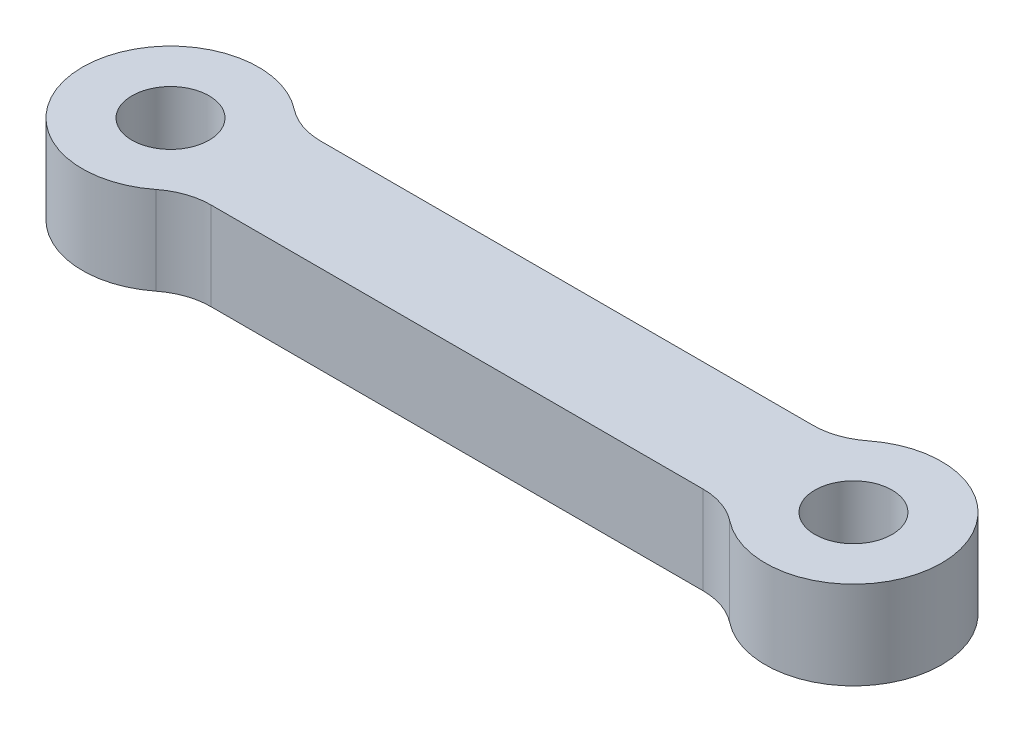
ISO-10303-21;
HEADER;
FILE_DESCRIPTION(('STEP AP214'),'2;1');
FILE_NAME('part.step','',(''),(''),'','','');
FILE_SCHEMA(('AUTOMOTIVE_DESIGN { 1 0 10303 214 1 1 1 1 }'));
ENDSEC;
DATA;
#1=APPLICATION_CONTEXT('core data for automotive mechanical design processes');
#2=APPLICATION_PROTOCOL_DEFINITION('international standard','automotive_design',2000,#1);
#3=PRODUCT_CONTEXT('',#1,'mechanical');
#4=PRODUCT('Part','Part','',(#3));
#5=PRODUCT_RELATED_PRODUCT_CATEGORY('part','',(#4));
#6=PRODUCT_DEFINITION_FORMATION('','',#4);
#7=PRODUCT_DEFINITION_CONTEXT('part definition',#1,'design');
#8=PRODUCT_DEFINITION('design','',#6,#7);
#9=PRODUCT_DEFINITION_SHAPE('','',#8);
#10=(LENGTH_UNIT() NAMED_UNIT(*) SI_UNIT(.MILLI.,.METRE.));
#11=(NAMED_UNIT(*) PLANE_ANGLE_UNIT() SI_UNIT($,.RADIAN.));
#12=(NAMED_UNIT(*) SI_UNIT($,.STERADIAN.) SOLID_ANGLE_UNIT());
#13=UNCERTAINTY_MEASURE_WITH_UNIT(LENGTH_MEASURE(1.E-05),#10,'distance_accuracy_value','');
#14=(GEOMETRIC_REPRESENTATION_CONTEXT(3) GLOBAL_UNCERTAINTY_ASSIGNED_CONTEXT((#13)) GLOBAL_UNIT_ASSIGNED_CONTEXT((#10,
#11,#12)) REPRESENTATION_CONTEXT('',''));
#15=CARTESIAN_POINT('',(0.,0.,0.));
#16=DIRECTION('',(0.,0.,1.));
#17=DIRECTION('',(1.,0.,0.));
#18=AXIS2_PLACEMENT_3D('',#15,#16,#17);
#19=CARTESIAN_POINT('',(31.,4.,0.));
#20=DIRECTION('',(0.,-1.,0.));
#21=DIRECTION('',(0.,0.,-1.));
#22=AXIS2_PLACEMENT_3D('',#19,#20,#21);
#23=CYLINDRICAL_SURFACE('',#22,4.00000000000001);
#24=CARTESIAN_POINT('',(31.,0.,0.));
#25=DIRECTION('',(0.,-1.,0.));
#26=DIRECTION('',(0.,0.,-1.));
#27=AXIS2_PLACEMENT_3D('',#24,#25,#26);
#28=CIRCLE('',#27,4.00000000000001);
#29=CARTESIAN_POINT('',(28.525641703473,0.,-3.14285714285714));
#30=VERTEX_POINT('',#29);
#31=CARTESIAN_POINT('',(28.525641703473,0.,3.14285714285714));
#32=VERTEX_POINT('',#31);
#33=EDGE_CURVE('E129',#30,#32,#28,.T.);
#34=ORIENTED_EDGE('',*,*,#33,.F.);
#35=DIRECTION('',(0.,-1.,0.));
#36=VECTOR('',#35,1.);
#37=CARTESIAN_POINT('',(28.525641703473,4.,-3.14285714285714));
#38=LINE('',#37,#36);
#39=CARTESIAN_POINT('',(28.525641703473,4.,-3.14285714285714));
#40=VERTEX_POINT('',#39);
#41=EDGE_CURVE('E11',#40,#30,#38,.T.);
#42=ORIENTED_EDGE('',*,*,#41,.F.);
#43=CARTESIAN_POINT('',(31.,4.,0.));
#44=DIRECTION('',(0.,-1.,0.));
#45=DIRECTION('',(0.,0.,-1.));
#46=AXIS2_PLACEMENT_3D('',#43,#44,#45);
#47=CIRCLE('',#46,4.00000000000001);
#48=CARTESIAN_POINT('',(28.525641703473,4.,3.14285714285714));
#49=VERTEX_POINT('',#48);
#50=EDGE_CURVE('E150',#40,#49,#47,.T.);
#51=ORIENTED_EDGE('',*,*,#50,.T.);
#52=DIRECTION('',(0.,-1.,0.));
#53=VECTOR('',#52,1.);
#54=CARTESIAN_POINT('',(28.525641703473,4.,3.14285714285714));
#55=LINE('',#54,#53);
#56=EDGE_CURVE('E35',#49,#32,#55,.T.);
#57=ORIENTED_EDGE('',*,*,#56,.T.);
#58=EDGE_LOOP('',(#34,#42,#51,#57));
#59=FACE_BOUND('',#58,.T.);
#60=ADVANCED_FACE('F32',(#59),#23,.T.);
#61=CARTESIAN_POINT('',(26.6698729810778,4.,-5.5));
#62=DIRECTION('',(0.,-1.,0.));
#63=DIRECTION('',(0.,0.,-1.));
#64=AXIS2_PLACEMENT_3D('',#61,#62,#63);
#65=CYLINDRICAL_SURFACE('',#64,3.);
#66=CARTESIAN_POINT('',(26.6698729810778,0.,-5.5));
#67=DIRECTION('',(0.,1.,0.));
#68=DIRECTION('',(0.,0.,1.));
#69=AXIS2_PLACEMENT_3D('',#66,#67,#68);
#70=CIRCLE('',#69,3.);
#71=CARTESIAN_POINT('',(26.6698729810778,0.,-2.5));
#72=VERTEX_POINT('',#71);
#73=EDGE_CURVE('E148',#72,#30,#70,.T.);
#74=ORIENTED_EDGE('',*,*,#73,.F.);
#75=DIRECTION('',(0.,-1.,0.));
#76=VECTOR('',#75,1.);
#77=CARTESIAN_POINT('',(26.6698729810778,4.,-2.5));
#78=LINE('',#77,#76);
#79=CARTESIAN_POINT('',(26.6698729810778,4.,-2.5));
#80=VERTEX_POINT('',#79);
#81=EDGE_CURVE('E41',#80,#72,#78,.T.);
#82=ORIENTED_EDGE('',*,*,#81,.F.);
#83=CARTESIAN_POINT('',(26.6698729810778,4.,-5.5));
#84=DIRECTION('',(0.,1.,0.));
#85=DIRECTION('',(0.,0.,1.));
#86=AXIS2_PLACEMENT_3D('',#83,#84,#85);
#87=CIRCLE('',#86,3.);
#88=EDGE_CURVE('E119',#80,#40,#87,.T.);
#89=ORIENTED_EDGE('',*,*,#88,.T.);
#90=ORIENTED_EDGE('',*,*,#41,.T.);
#91=EDGE_LOOP('',(#74,#82,#89,#90));
#92=FACE_BOUND('',#91,.T.);
#93=ADVANCED_FACE('F162',(#92),#65,.F.);
#94=CARTESIAN_POINT('',(4.3301270189222,4.,-2.5));
#95=DIRECTION('',(0.,0.,-1.));
#96=DIRECTION('',(-1.,0.,0.));
#97=AXIS2_PLACEMENT_3D('',#94,#95,#96);
#98=PLANE('',#97);
#99=DIRECTION('',(1.,0.,0.));
#100=VECTOR('',#99,1.);
#101=CARTESIAN_POINT('',(4.3301270189222,0.,-2.5));
#102=LINE('',#101,#100);
#103=CARTESIAN_POINT('',(4.3301270189222,0.,-2.5));
#104=VERTEX_POINT('',#103);
#105=EDGE_CURVE('E106',#104,#72,#102,.T.);
#106=ORIENTED_EDGE('',*,*,#105,.F.);
#107=DIRECTION('',(0.,-1.,0.));
#108=VECTOR('',#107,1.);
#109=CARTESIAN_POINT('',(4.3301270189222,4.,-2.5));
#110=LINE('',#109,#108);
#111=CARTESIAN_POINT('',(4.3301270189222,4.,-2.5));
#112=VERTEX_POINT('',#111);
#113=EDGE_CURVE('E101',#112,#104,#110,.T.);
#114=ORIENTED_EDGE('',*,*,#113,.F.);
#115=DIRECTION('',(1.,0.,0.));
#116=VECTOR('',#115,1.);
#117=CARTESIAN_POINT('',(4.3301270189222,4.,-2.5));
#118=LINE('',#117,#116);
#119=EDGE_CURVE('E104',#112,#80,#118,.T.);
#120=ORIENTED_EDGE('',*,*,#119,.T.);
#121=ORIENTED_EDGE('',*,*,#81,.T.);
#122=EDGE_LOOP('',(#106,#114,#120,#121));
#123=FACE_BOUND('',#122,.T.);
#124=ADVANCED_FACE('F103',(#123),#98,.T.);
#125=CARTESIAN_POINT('',(4.3301270189222,4.,-5.5));
#126=DIRECTION('',(0.,-1.,0.));
#127=DIRECTION('',(0.,0.,-1.));
#128=AXIS2_PLACEMENT_3D('',#125,#126,#127);
#129=CYLINDRICAL_SURFACE('',#128,3.);
#130=CARTESIAN_POINT('',(4.3301270189222,0.,-5.5));
#131=DIRECTION('',(0.,1.,0.));
#132=DIRECTION('',(0.,0.,1.));
#133=AXIS2_PLACEMENT_3D('',#130,#131,#132);
#134=CIRCLE('',#133,3.);
#135=CARTESIAN_POINT('',(2.47435829652697,0.,-3.14285714285714));
#136=VERTEX_POINT('',#135);
#137=EDGE_CURVE('E145',#136,#104,#134,.T.);
#138=ORIENTED_EDGE('',*,*,#137,.F.);
#139=DIRECTION('',(0.,-1.,0.));
#140=VECTOR('',#139,1.);
#141=CARTESIAN_POINT('',(2.47435829652697,4.,-3.14285714285714));
#142=LINE('',#141,#140);
#143=CARTESIAN_POINT('',(2.47435829652697,4.,-3.14285714285714));
#144=VERTEX_POINT('',#143);
#145=EDGE_CURVE('E111',#144,#136,#142,.T.);
#146=ORIENTED_EDGE('',*,*,#145,.F.);
#147=CARTESIAN_POINT('',(4.3301270189222,4.,-5.5));
#148=DIRECTION('',(0.,1.,0.));
#149=DIRECTION('',(0.,0.,1.));
#150=AXIS2_PLACEMENT_3D('',#147,#148,#149);
#151=CIRCLE('',#150,3.);
#152=EDGE_CURVE('E117',#144,#112,#151,.T.);
#153=ORIENTED_EDGE('',*,*,#152,.T.);
#154=ORIENTED_EDGE('',*,*,#113,.T.);
#155=EDGE_LOOP('',(#138,#146,#153,#154));
#156=FACE_BOUND('',#155,.T.);
#157=ADVANCED_FACE('F121',(#156),#129,.F.);
#158=CARTESIAN_POINT('',(0.,4.,0.));
#159=DIRECTION('',(0.,-1.,0.));
#160=DIRECTION('',(0.,0.,-1.));
#161=AXIS2_PLACEMENT_3D('',#158,#159,#160);
#162=CYLINDRICAL_SURFACE('',#161,4.);
#163=CARTESIAN_POINT('',(0.,0.,0.));
#164=DIRECTION('',(0.,-1.,0.));
#165=DIRECTION('',(0.,0.,-1.));
#166=AXIS2_PLACEMENT_3D('',#163,#164,#165);
#167=CIRCLE('',#166,4.);
#168=CARTESIAN_POINT('',(2.47435829652697,0.,3.14285714285714));
#169=VERTEX_POINT('',#168);
#170=EDGE_CURVE('E142',#169,#136,#167,.T.);
#171=ORIENTED_EDGE('',*,*,#170,.F.);
#172=DIRECTION('',(0.,-1.,0.));
#173=VECTOR('',#172,1.);
#174=CARTESIAN_POINT('',(2.47435829652697,4.,3.14285714285714));
#175=LINE('',#174,#173);
#176=CARTESIAN_POINT('',(2.47435829652697,4.,3.14285714285714));
#177=VERTEX_POINT('',#176);
#178=EDGE_CURVE('E154',#177,#169,#175,.T.);
#179=ORIENTED_EDGE('',*,*,#178,.F.);
#180=CARTESIAN_POINT('',(0.,4.,0.));
#181=DIRECTION('',(0.,-1.,0.));
#182=DIRECTION('',(0.,0.,-1.));
#183=AXIS2_PLACEMENT_3D('',#180,#181,#182);
#184=CIRCLE('',#183,4.);
#185=EDGE_CURVE('E122',#177,#144,#184,.T.);
#186=ORIENTED_EDGE('',*,*,#185,.T.);
#187=ORIENTED_EDGE('',*,*,#145,.T.);
#188=EDGE_LOOP('',(#171,#179,#186,#187));
#189=FACE_BOUND('',#188,.T.);
#190=ADVANCED_FACE('F175',(#189),#162,.T.);
#191=CARTESIAN_POINT('',(4.3301270189222,4.,5.5));
#192=DIRECTION('',(0.,-1.,0.));
#193=DIRECTION('',(0.,0.,-1.));
#194=AXIS2_PLACEMENT_3D('',#191,#192,#193);
#195=CYLINDRICAL_SURFACE('',#194,3.);
#196=CARTESIAN_POINT('',(4.3301270189222,0.,5.5));
#197=DIRECTION('',(0.,1.,0.));
#198=DIRECTION('',(0.,0.,1.));
#199=AXIS2_PLACEMENT_3D('',#196,#197,#198);
#200=CIRCLE('',#199,3.);
#201=CARTESIAN_POINT('',(4.3301270189222,0.,2.5));
#202=VERTEX_POINT('',#201);
#203=EDGE_CURVE('E139',#202,#169,#200,.T.);
#204=ORIENTED_EDGE('',*,*,#203,.F.);
#205=DIRECTION('',(0.,-1.,0.));
#206=VECTOR('',#205,1.);
#207=CARTESIAN_POINT('',(4.3301270189222,4.,2.5));
#208=LINE('',#207,#206);
#209=CARTESIAN_POINT('',(4.3301270189222,4.,2.5));
#210=VERTEX_POINT('',#209);
#211=EDGE_CURVE('E156',#210,#202,#208,.T.);
#212=ORIENTED_EDGE('',*,*,#211,.F.);
#213=CARTESIAN_POINT('',(4.3301270189222,4.,5.5));
#214=DIRECTION('',(0.,1.,0.));
#215=DIRECTION('',(0.,0.,1.));
#216=AXIS2_PLACEMENT_3D('',#213,#214,#215);
#217=CIRCLE('',#216,3.);
#218=EDGE_CURVE('E124',#210,#177,#217,.T.);
#219=ORIENTED_EDGE('',*,*,#218,.T.);
#220=ORIENTED_EDGE('',*,*,#178,.T.);
#221=EDGE_LOOP('',(#204,#212,#219,#220));
#222=FACE_BOUND('',#221,.T.);
#223=ADVANCED_FACE('F178',(#222),#195,.F.);
#224=CARTESIAN_POINT('',(26.6698729810778,4.,2.5));
#225=DIRECTION('',(0.,0.,1.));
#226=DIRECTION('',(1.,0.,0.));
#227=AXIS2_PLACEMENT_3D('',#224,#225,#226);
#228=PLANE('',#227);
#229=DIRECTION('',(-1.,0.,0.));
#230=VECTOR('',#229,1.);
#231=CARTESIAN_POINT('',(26.6698729810778,0.,2.5));
#232=LINE('',#231,#230);
#233=CARTESIAN_POINT('',(26.6698729810778,0.,2.5));
#234=VERTEX_POINT('',#233);
#235=EDGE_CURVE('E136',#234,#202,#232,.T.);
#236=ORIENTED_EDGE('',*,*,#235,.F.);
#237=DIRECTION('',(0.,-1.,0.));
#238=VECTOR('',#237,1.);
#239=CARTESIAN_POINT('',(26.6698729810778,4.,2.5));
#240=LINE('',#239,#238);
#241=CARTESIAN_POINT('',(26.6698729810778,4.,2.5));
#242=VERTEX_POINT('',#241);
#243=EDGE_CURVE('E157',#242,#234,#240,.T.);
#244=ORIENTED_EDGE('',*,*,#243,.F.);
#245=DIRECTION('',(-1.,0.,0.));
#246=VECTOR('',#245,1.);
#247=CARTESIAN_POINT('',(26.6698729810778,4.,2.5));
#248=LINE('',#247,#246);
#249=EDGE_CURVE('E224',#242,#210,#248,.T.);
#250=ORIENTED_EDGE('',*,*,#249,.T.);
#251=ORIENTED_EDGE('',*,*,#211,.T.);
#252=EDGE_LOOP('',(#236,#244,#250,#251));
#253=FACE_BOUND('',#252,.T.);
#254=ADVANCED_FACE('F182',(#253),#228,.T.);
#255=CARTESIAN_POINT('',(26.6698729810778,4.,5.5));
#256=DIRECTION('',(0.,-1.,0.));
#257=DIRECTION('',(0.,0.,-1.));
#258=AXIS2_PLACEMENT_3D('',#255,#256,#257);
#259=CYLINDRICAL_SURFACE('',#258,3.);
#260=CARTESIAN_POINT('',(26.6698729810778,0.,5.5));
#261=DIRECTION('',(0.,1.,0.));
#262=DIRECTION('',(0.,0.,1.));
#263=AXIS2_PLACEMENT_3D('',#260,#261,#262);
#264=CIRCLE('',#263,3.);
#265=EDGE_CURVE('E132',#32,#234,#264,.T.);
#266=ORIENTED_EDGE('',*,*,#265,.F.);
#267=ORIENTED_EDGE('',*,*,#56,.F.);
#268=CARTESIAN_POINT('',(26.6698729810778,4.,5.5));
#269=DIRECTION('',(0.,1.,0.));
#270=DIRECTION('',(0.,0.,1.));
#271=AXIS2_PLACEMENT_3D('',#268,#269,#270);
#272=CIRCLE('',#271,3.);
#273=EDGE_CURVE('E222',#49,#242,#272,.T.);
#274=ORIENTED_EDGE('',*,*,#273,.T.);
#275=ORIENTED_EDGE('',*,*,#243,.T.);
#276=EDGE_LOOP('',(#266,#267,#274,#275));
#277=FACE_BOUND('',#276,.T.);
#278=ADVANCED_FACE('F159',(#277),#259,.F.);
#279=CARTESIAN_POINT('',(31.,4.,0.));
#280=DIRECTION('',(0.,-1.,0.));
#281=DIRECTION('',(0.,0.,-1.));
#282=AXIS2_PLACEMENT_3D('',#279,#280,#281);
#283=PLANE('',#282);
#284=CARTESIAN_POINT('',(0.,4.,0.));
#285=DIRECTION('',(0.,-1.,0.));
#286=DIRECTION('',(0.,0.,1.));
#287=AXIS2_PLACEMENT_3D('',#284,#285,#286);
#288=CIRCLE('',#287,1.75);
#289=CARTESIAN_POINT('',(0.,4.,1.75));
#290=VERTEX_POINT('',#289);
#291=EDGE_CURVE('E209',#290,#290,#288,.T.);
#292=ORIENTED_EDGE('',*,*,#291,.T.);
#293=EDGE_LOOP('',(#292));
#294=FACE_BOUND('',#293,.T.);
#295=CARTESIAN_POINT('',(31.,4.,0.));
#296=DIRECTION('',(0.,-1.,0.));
#297=DIRECTION('',(0.,0.,1.));
#298=AXIS2_PLACEMENT_3D('',#295,#296,#297);
#299=CIRCLE('',#298,1.75);
#300=CARTESIAN_POINT('',(31.,4.,1.75));
#301=VERTEX_POINT('',#300);
#302=EDGE_CURVE('E133',#301,#301,#299,.T.);
#303=ORIENTED_EDGE('',*,*,#302,.T.);
#304=EDGE_LOOP('',(#303));
#305=FACE_BOUND('',#304,.T.);
#306=ORIENTED_EDGE('',*,*,#50,.F.);
#307=ORIENTED_EDGE('',*,*,#88,.F.);
#308=ORIENTED_EDGE('',*,*,#119,.F.);
#309=ORIENTED_EDGE('',*,*,#152,.F.);
#310=ORIENTED_EDGE('',*,*,#185,.F.);
#311=ORIENTED_EDGE('',*,*,#218,.F.);
#312=ORIENTED_EDGE('',*,*,#249,.F.);
#313=ORIENTED_EDGE('',*,*,#273,.F.);
#314=EDGE_LOOP('',(#306,#307,#308,#309,#310,#311,#312,#313));
#315=FACE_BOUND('',#314,.T.);
#316=ADVANCED_FACE('F115',(#294,#305,#315),#283,.F.);
#317=CARTESIAN_POINT('',(31.,0.,0.));
#318=DIRECTION('',(0.,-1.,0.));
#319=DIRECTION('',(0.,0.,-1.));
#320=AXIS2_PLACEMENT_3D('',#317,#318,#319);
#321=PLANE('',#320);
#322=CARTESIAN_POINT('',(0.,0.,0.));
#323=DIRECTION('',(0.,-1.,0.));
#324=DIRECTION('',(0.,0.,1.));
#325=AXIS2_PLACEMENT_3D('',#322,#323,#324);
#326=CIRCLE('',#325,1.75);
#327=CARTESIAN_POINT('',(0.,0.,1.75));
#328=VERTEX_POINT('',#327);
#329=EDGE_CURVE('E212',#328,#328,#326,.T.);
#330=ORIENTED_EDGE('',*,*,#329,.F.);
#331=EDGE_LOOP('',(#330));
#332=FACE_BOUND('',#331,.T.);
#333=CARTESIAN_POINT('',(31.,0.,0.));
#334=DIRECTION('',(0.,-1.,0.));
#335=DIRECTION('',(0.,0.,1.));
#336=AXIS2_PLACEMENT_3D('',#333,#334,#335);
#337=CIRCLE('',#336,1.75);
#338=CARTESIAN_POINT('',(31.,0.,1.75));
#339=VERTEX_POINT('',#338);
#340=EDGE_CURVE('E214',#339,#339,#337,.T.);
#341=ORIENTED_EDGE('',*,*,#340,.F.);
#342=EDGE_LOOP('',(#341));
#343=FACE_BOUND('',#342,.T.);
#344=ORIENTED_EDGE('',*,*,#33,.T.);
#345=ORIENTED_EDGE('',*,*,#265,.T.);
#346=ORIENTED_EDGE('',*,*,#235,.T.);
#347=ORIENTED_EDGE('',*,*,#203,.T.);
#348=ORIENTED_EDGE('',*,*,#170,.T.);
#349=ORIENTED_EDGE('',*,*,#137,.T.);
#350=ORIENTED_EDGE('',*,*,#105,.T.);
#351=ORIENTED_EDGE('',*,*,#73,.T.);
#352=EDGE_LOOP('',(#344,#345,#346,#347,#348,#349,#350,#351));
#353=FACE_BOUND('',#352,.T.);
#354=ADVANCED_FACE('F161',(#332,#343,#353),#321,.T.);
#355=CARTESIAN_POINT('',(31.,4.,0.));
#356=DIRECTION('',(0.,-1.,0.));
#357=DIRECTION('',(0.,0.,-1.));
#358=AXIS2_PLACEMENT_3D('',#355,#356,#357);
#359=CYLINDRICAL_SURFACE('',#358,1.75);
#360=ORIENTED_EDGE('',*,*,#302,.F.);
#361=EDGE_LOOP('',(#360));
#362=FACE_BOUND('',#361,.T.);
#363=ORIENTED_EDGE('',*,*,#340,.T.);
#364=EDGE_LOOP('',(#363));
#365=FACE_BOUND('',#364,.T.);
#366=ADVANCED_FACE('F194',(#362,#365),#359,.F.);
#367=CARTESIAN_POINT('',(0.,4.,0.));
#368=DIRECTION('',(0.,-1.,0.));
#369=DIRECTION('',(0.,0.,-1.));
#370=AXIS2_PLACEMENT_3D('',#367,#368,#369);
#371=CYLINDRICAL_SURFACE('',#370,1.75);
#372=ORIENTED_EDGE('',*,*,#291,.F.);
#373=EDGE_LOOP('',(#372));
#374=FACE_BOUND('',#373,.T.);
#375=ORIENTED_EDGE('',*,*,#329,.T.);
#376=EDGE_LOOP('',(#375));
#377=FACE_BOUND('',#376,.T.);
#378=ADVANCED_FACE('F201',(#374,#377),#371,.F.);
#379=CLOSED_SHELL('',(#60,#93,#124,#157,#190,#223,#254,#278,#316,#354,#366,#378));
#380=MANIFOLD_SOLID_BREP('B2',#379);
#381=ADVANCED_BREP_SHAPE_REPRESENTATION('',(#18,#380),#14);
#382=SHAPE_DEFINITION_REPRESENTATION(#9,#381);
ENDSEC;
END-ISO-10303-21;
